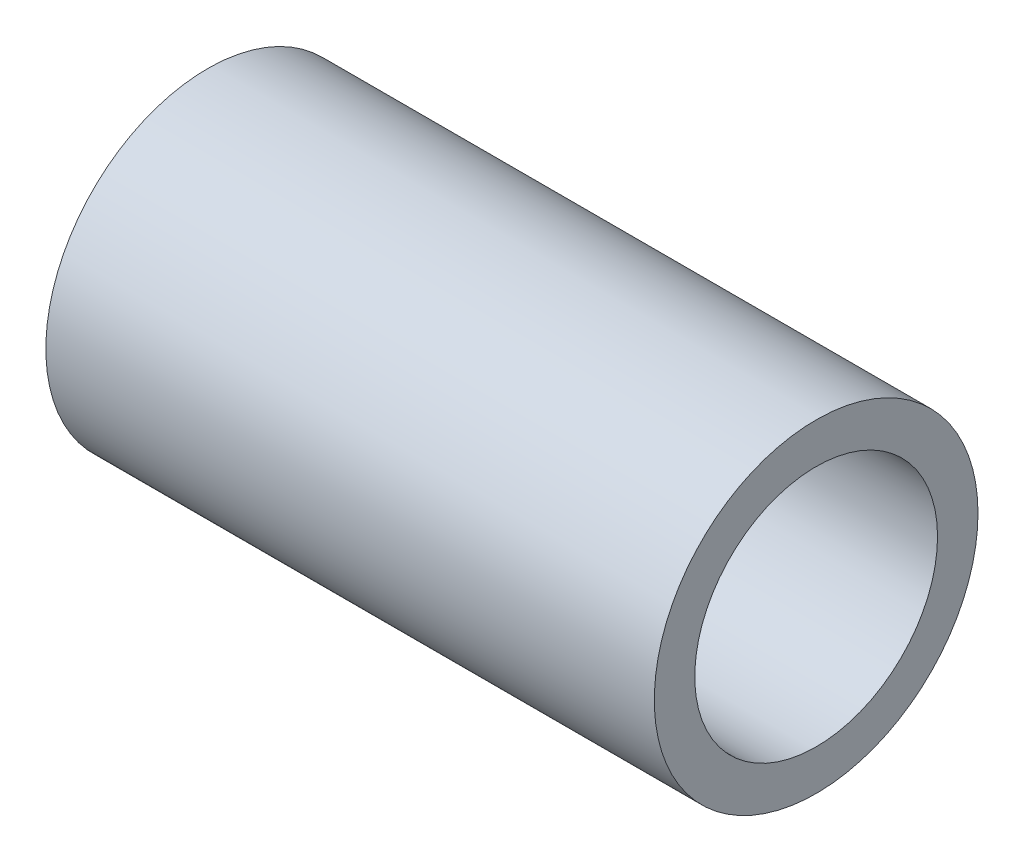
ISO-10303-21;
HEADER;
FILE_DESCRIPTION(('STEP AP214'),'2;1');
FILE_NAME('part.step','',(''),(''),'','','');
FILE_SCHEMA(('AUTOMOTIVE_DESIGN { 1 0 10303 214 1 1 1 1 }'));
ENDSEC;
DATA;
#1=APPLICATION_CONTEXT('core data for automotive mechanical design processes');
#2=APPLICATION_PROTOCOL_DEFINITION('international standard','automotive_design',2000,#1);
#3=PRODUCT_CONTEXT('',#1,'mechanical');
#4=PRODUCT('Part','Part','',(#3));
#5=PRODUCT_RELATED_PRODUCT_CATEGORY('part','',(#4));
#6=PRODUCT_DEFINITION_FORMATION('','',#4);
#7=PRODUCT_DEFINITION_CONTEXT('part definition',#1,'design');
#8=PRODUCT_DEFINITION('design','',#6,#7);
#9=PRODUCT_DEFINITION_SHAPE('','',#8);
#10=(LENGTH_UNIT() NAMED_UNIT(*) SI_UNIT(.MILLI.,.METRE.));
#11=(NAMED_UNIT(*) PLANE_ANGLE_UNIT() SI_UNIT($,.RADIAN.));
#12=(NAMED_UNIT(*) SI_UNIT($,.STERADIAN.) SOLID_ANGLE_UNIT());
#13=UNCERTAINTY_MEASURE_WITH_UNIT(LENGTH_MEASURE(1.E-05),#10,'distance_accuracy_value','');
#14=(GEOMETRIC_REPRESENTATION_CONTEXT(3) GLOBAL_UNCERTAINTY_ASSIGNED_CONTEXT((#13)) GLOBAL_UNIT_ASSIGNED_CONTEXT((#10,
#11,#12)) REPRESENTATION_CONTEXT('',''));
#15=CARTESIAN_POINT('',(0.,0.,0.));
#16=DIRECTION('',(0.,0.,1.));
#17=DIRECTION('',(1.,0.,0.));
#18=AXIS2_PLACEMENT_3D('',#15,#16,#17);
#19=CARTESIAN_POINT('',(59.1375,0.,0.));
#20=DIRECTION('',(1.,0.,0.));
#21=DIRECTION('',(0.,0.,-1.));
#22=AXIS2_PLACEMENT_3D('',#19,#20,#21);
#23=PLANE('',#22);
#24=CARTESIAN_POINT('',(59.1375,0.,0.));
#25=DIRECTION('',(1.,0.,0.));
#26=DIRECTION('',(0.,0.,-1.));
#27=AXIS2_PLACEMENT_3D('',#24,#25,#26);
#28=CIRCLE('',#27,4.);
#29=CARTESIAN_POINT('',(59.1375,0.,-4.));
#30=VERTEX_POINT('',#29);
#31=EDGE_CURVE('E10',#30,#30,#28,.T.);
#32=ORIENTED_EDGE('',*,*,#31,.T.);
#33=EDGE_LOOP('',(#32));
#34=FACE_BOUND('',#33,.T.);
#35=CARTESIAN_POINT('',(59.1375,0.,0.));
#36=DIRECTION('',(1.,0.,0.));
#37=DIRECTION('',(0.,0.,-1.));
#38=AXIS2_PLACEMENT_3D('',#35,#36,#37);
#39=CIRCLE('',#38,3.);
#40=CARTESIAN_POINT('',(59.1375,0.,-3.));
#41=VERTEX_POINT('',#40);
#42=EDGE_CURVE('E56',#41,#41,#39,.T.);
#43=ORIENTED_EDGE('',*,*,#42,.F.);
#44=EDGE_LOOP('',(#43));
#45=FACE_BOUND('',#44,.T.);
#46=ADVANCED_FACE('F43',(#34,#45),#23,.T.);
#47=CARTESIAN_POINT('',(44.1,0.,0.));
#48=DIRECTION('',(1.,0.,0.));
#49=DIRECTION('',(0.,0.,-1.));
#50=AXIS2_PLACEMENT_3D('',#47,#48,#49);
#51=PLANE('',#50);
#52=CARTESIAN_POINT('',(44.1,0.,0.));
#53=DIRECTION('',(1.,0.,0.));
#54=DIRECTION('',(0.,0.,-1.));
#55=AXIS2_PLACEMENT_3D('',#52,#53,#54);
#56=CIRCLE('',#55,4.);
#57=CARTESIAN_POINT('',(44.1,0.,-4.));
#58=VERTEX_POINT('',#57);
#59=EDGE_CURVE('E47',#58,#58,#56,.T.);
#60=ORIENTED_EDGE('',*,*,#59,.F.);
#61=EDGE_LOOP('',(#60));
#62=FACE_BOUND('',#61,.T.);
#63=CARTESIAN_POINT('',(44.1,0.,0.));
#64=DIRECTION('',(1.,0.,0.));
#65=DIRECTION('',(0.,0.,-1.));
#66=AXIS2_PLACEMENT_3D('',#63,#64,#65);
#67=CIRCLE('',#66,3.);
#68=CARTESIAN_POINT('',(44.1,0.,-3.));
#69=VERTEX_POINT('',#68);
#70=EDGE_CURVE('E58',#69,#69,#67,.T.);
#71=ORIENTED_EDGE('',*,*,#70,.T.);
#72=EDGE_LOOP('',(#71));
#73=FACE_BOUND('',#72,.T.);
#74=ADVANCED_FACE('F70',(#62,#73),#51,.F.);
#75=CARTESIAN_POINT('',(59.1375,0.,0.));
#76=DIRECTION('',(-1.,0.,0.));
#77=DIRECTION('',(0.,0.,1.));
#78=AXIS2_PLACEMENT_3D('',#75,#76,#77);
#79=CYLINDRICAL_SURFACE('',#78,4.);
#80=ORIENTED_EDGE('',*,*,#31,.F.);
#81=EDGE_LOOP('',(#80));
#82=FACE_BOUND('',#81,.T.);
#83=ORIENTED_EDGE('',*,*,#59,.T.);
#84=EDGE_LOOP('',(#83));
#85=FACE_BOUND('',#84,.T.);
#86=ADVANCED_FACE('F45',(#82,#85),#79,.T.);
#87=CARTESIAN_POINT('',(59.1375,0.,0.));
#88=DIRECTION('',(-1.,0.,0.));
#89=DIRECTION('',(0.,0.,1.));
#90=AXIS2_PLACEMENT_3D('',#87,#88,#89);
#91=CYLINDRICAL_SURFACE('',#90,3.);
#92=ORIENTED_EDGE('',*,*,#42,.T.);
#93=EDGE_LOOP('',(#92));
#94=FACE_BOUND('',#93,.T.);
#95=ORIENTED_EDGE('',*,*,#70,.F.);
#96=EDGE_LOOP('',(#95));
#97=FACE_BOUND('',#96,.T.);
#98=ADVANCED_FACE('F66',(#94,#97),#91,.F.);
#99=CLOSED_SHELL('',(#46,#74,#86,#98));
#100=MANIFOLD_SOLID_BREP('B2',#99);
#101=ADVANCED_BREP_SHAPE_REPRESENTATION('',(#18,#100),#14);
#102=SHAPE_DEFINITION_REPRESENTATION(#9,#101);
ENDSEC;
END-ISO-10303-21;
